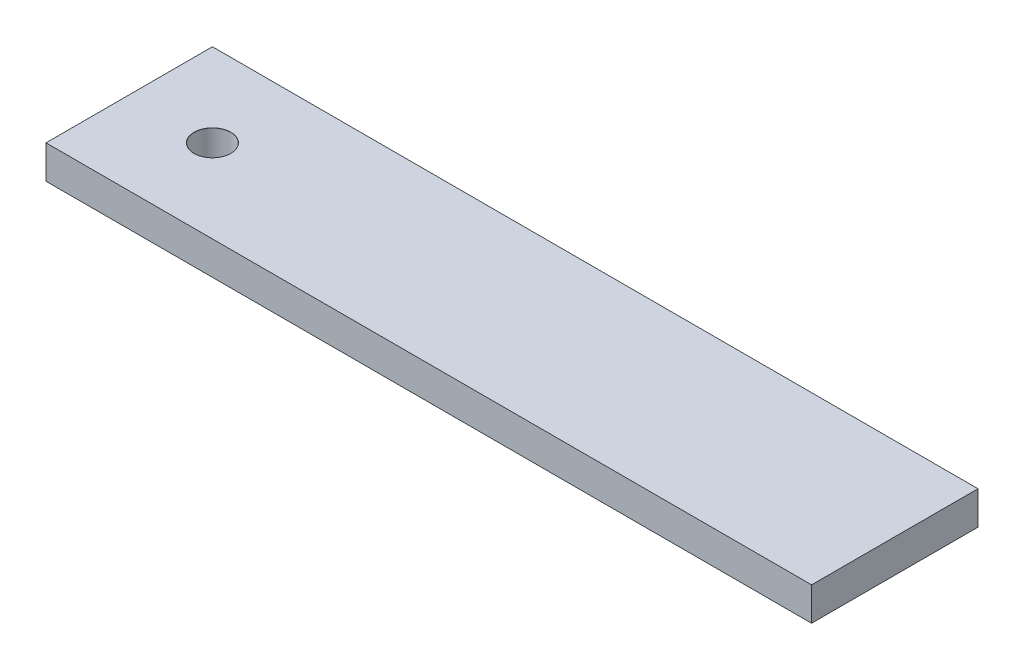
ISO-10303-21;
HEADER;
FILE_DESCRIPTION(('STEP AP214'),'2;1');
FILE_NAME('part.step','',(''),(''),'','','');
FILE_SCHEMA(('AUTOMOTIVE_DESIGN { 1 0 10303 214 1 1 1 1 }'));
ENDSEC;
DATA;
#1=APPLICATION_CONTEXT('core data for automotive mechanical design processes');
#2=APPLICATION_PROTOCOL_DEFINITION('international standard','automotive_design',2000,#1);
#3=PRODUCT_CONTEXT('',#1,'mechanical');
#4=PRODUCT('Part','Part','',(#3));
#5=PRODUCT_RELATED_PRODUCT_CATEGORY('part','',(#4));
#6=PRODUCT_DEFINITION_FORMATION('','',#4);
#7=PRODUCT_DEFINITION_CONTEXT('part definition',#1,'design');
#8=PRODUCT_DEFINITION('design','',#6,#7);
#9=PRODUCT_DEFINITION_SHAPE('','',#8);
#10=(LENGTH_UNIT() NAMED_UNIT(*) SI_UNIT(.MILLI.,.METRE.));
#11=(NAMED_UNIT(*) PLANE_ANGLE_UNIT() SI_UNIT($,.RADIAN.));
#12=(NAMED_UNIT(*) SI_UNIT($,.STERADIAN.) SOLID_ANGLE_UNIT());
#13=UNCERTAINTY_MEASURE_WITH_UNIT(LENGTH_MEASURE(1.E-05),#10,'distance_accuracy_value','');
#14=(GEOMETRIC_REPRESENTATION_CONTEXT(3) GLOBAL_UNCERTAINTY_ASSIGNED_CONTEXT((#13)) GLOBAL_UNIT_ASSIGNED_CONTEXT((#10,
#11,#12)) REPRESENTATION_CONTEXT('',''));
#15=CARTESIAN_POINT('',(0.,0.,0.));
#16=DIRECTION('',(0.,0.,1.));
#17=DIRECTION('',(1.,0.,0.));
#18=AXIS2_PLACEMENT_3D('',#15,#16,#17);
#19=CARTESIAN_POINT('',(115.,10.,-25.));
#20=DIRECTION('',(-1.,0.,0.));
#21=DIRECTION('',(0.,0.,1.));
#22=AXIS2_PLACEMENT_3D('',#19,#20,#21);
#23=PLANE('',#22);
#24=DIRECTION('',(0.,0.,-1.));
#25=VECTOR('',#24,1.);
#26=CARTESIAN_POINT('',(115.,0.,-25.));
#27=LINE('',#26,#25);
#28=CARTESIAN_POINT('',(115.,0.,25.));
#29=VERTEX_POINT('',#28);
#30=CARTESIAN_POINT('',(115.,0.,-25.));
#31=VERTEX_POINT('',#30);
#32=EDGE_CURVE('E102',#29,#31,#27,.T.);
#33=ORIENTED_EDGE('',*,*,#32,.T.);
#34=DIRECTION('',(0.,-1.,0.));
#35=VECTOR('',#34,1.);
#36=CARTESIAN_POINT('',(115.,10.,-25.));
#37=LINE('',#36,#35);
#38=CARTESIAN_POINT('',(115.,10.,-25.));
#39=VERTEX_POINT('',#38);
#40=EDGE_CURVE('E11',#39,#31,#37,.T.);
#41=ORIENTED_EDGE('',*,*,#40,.F.);
#42=DIRECTION('',(0.,0.,-1.));
#43=VECTOR('',#42,1.);
#44=CARTESIAN_POINT('',(115.,10.,-25.));
#45=LINE('',#44,#43);
#46=CARTESIAN_POINT('',(115.,10.,25.));
#47=VERTEX_POINT('',#46);
#48=EDGE_CURVE('E90',#47,#39,#45,.T.);
#49=ORIENTED_EDGE('',*,*,#48,.F.);
#50=DIRECTION('',(0.,-1.,0.));
#51=VECTOR('',#50,1.);
#52=CARTESIAN_POINT('',(115.,10.,25.));
#53=LINE('',#52,#51);
#54=EDGE_CURVE('E98',#47,#29,#53,.T.);
#55=ORIENTED_EDGE('',*,*,#54,.T.);
#56=EDGE_LOOP('',(#33,#41,#49,#55));
#57=FACE_BOUND('',#56,.T.);
#58=ADVANCED_FACE('F39',(#57),#23,.F.);
#59=CARTESIAN_POINT('',(-115.,10.,-25.));
#60=DIRECTION('',(0.,0.,1.));
#61=DIRECTION('',(1.,0.,0.));
#62=AXIS2_PLACEMENT_3D('',#59,#60,#61);
#63=PLANE('',#62);
#64=DIRECTION('',(-1.,0.,0.));
#65=VECTOR('',#64,1.);
#66=CARTESIAN_POINT('',(-115.,0.,-25.));
#67=LINE('',#66,#65);
#68=CARTESIAN_POINT('',(-115.,0.,-25.));
#69=VERTEX_POINT('',#68);
#70=EDGE_CURVE('E94',#31,#69,#67,.T.);
#71=ORIENTED_EDGE('',*,*,#70,.T.);
#72=DIRECTION('',(0.,-1.,0.));
#73=VECTOR('',#72,1.);
#74=CARTESIAN_POINT('',(-115.,10.,-25.));
#75=LINE('',#74,#73);
#76=CARTESIAN_POINT('',(-115.,10.,-25.));
#77=VERTEX_POINT('',#76);
#78=EDGE_CURVE('E47',#77,#69,#75,.T.);
#79=ORIENTED_EDGE('',*,*,#78,.F.);
#80=DIRECTION('',(-1.,0.,0.));
#81=VECTOR('',#80,1.);
#82=CARTESIAN_POINT('',(-115.,10.,-25.));
#83=LINE('',#82,#81);
#84=EDGE_CURVE('E85',#39,#77,#83,.T.);
#85=ORIENTED_EDGE('',*,*,#84,.F.);
#86=ORIENTED_EDGE('',*,*,#40,.T.);
#87=EDGE_LOOP('',(#71,#79,#85,#86));
#88=FACE_BOUND('',#87,.T.);
#89=ADVANCED_FACE('F93',(#88),#63,.F.);
#90=CARTESIAN_POINT('',(-115.,10.,-25.));
#91=DIRECTION('',(1.,0.,0.));
#92=DIRECTION('',(0.,0.,-1.));
#93=AXIS2_PLACEMENT_3D('',#90,#91,#92);
#94=PLANE('',#93);
#95=DIRECTION('',(0.,0.,1.));
#96=VECTOR('',#95,1.);
#97=CARTESIAN_POINT('',(-115.,0.,-25.));
#98=LINE('',#97,#96);
#99=CARTESIAN_POINT('',(-115.,0.,25.));
#100=VERTEX_POINT('',#99);
#101=EDGE_CURVE('E72',#69,#100,#98,.T.);
#102=ORIENTED_EDGE('',*,*,#101,.T.);
#103=DIRECTION('',(0.,-1.,0.));
#104=VECTOR('',#103,1.);
#105=CARTESIAN_POINT('',(-115.,10.,25.));
#106=LINE('',#105,#104);
#107=CARTESIAN_POINT('',(-115.,10.,25.));
#108=VERTEX_POINT('',#107);
#109=EDGE_CURVE('E95',#108,#100,#106,.T.);
#110=ORIENTED_EDGE('',*,*,#109,.F.);
#111=DIRECTION('',(0.,0.,1.));
#112=VECTOR('',#111,1.);
#113=CARTESIAN_POINT('',(-115.,10.,-25.));
#114=LINE('',#113,#112);
#115=EDGE_CURVE('E88',#77,#108,#114,.T.);
#116=ORIENTED_EDGE('',*,*,#115,.F.);
#117=ORIENTED_EDGE('',*,*,#78,.T.);
#118=EDGE_LOOP('',(#102,#110,#116,#117));
#119=FACE_BOUND('',#118,.T.);
#120=ADVANCED_FACE('F96',(#119),#94,.F.);
#121=CARTESIAN_POINT('',(-115.,10.,25.));
#122=DIRECTION('',(0.,0.,-1.));
#123=DIRECTION('',(-1.,0.,0.));
#124=AXIS2_PLACEMENT_3D('',#121,#122,#123);
#125=PLANE('',#124);
#126=DIRECTION('',(1.,0.,0.));
#127=VECTOR('',#126,1.);
#128=CARTESIAN_POINT('',(-115.,0.,25.));
#129=LINE('',#128,#127);
#130=EDGE_CURVE('E78',#100,#29,#129,.T.);
#131=ORIENTED_EDGE('',*,*,#130,.T.);
#132=ORIENTED_EDGE('',*,*,#54,.F.);
#133=DIRECTION('',(1.,0.,0.));
#134=VECTOR('',#133,1.);
#135=CARTESIAN_POINT('',(-115.,10.,25.));
#136=LINE('',#135,#134);
#137=EDGE_CURVE('E55',#108,#47,#136,.T.);
#138=ORIENTED_EDGE('',*,*,#137,.F.);
#139=ORIENTED_EDGE('',*,*,#109,.T.);
#140=EDGE_LOOP('',(#131,#132,#138,#139));
#141=FACE_BOUND('',#140,.T.);
#142=ADVANCED_FACE('F110',(#141),#125,.F.);
#143=CARTESIAN_POINT('',(0.,10.,0.));
#144=DIRECTION('',(0.,1.,0.));
#145=DIRECTION('',(0.,0.,1.));
#146=AXIS2_PLACEMENT_3D('',#143,#144,#145);
#147=PLANE('',#146);
#148=CARTESIAN_POINT('',(-90.,10.,0.));
#149=DIRECTION('',(0.,1.,0.));
#150=DIRECTION('',(0.,0.,1.));
#151=AXIS2_PLACEMENT_3D('',#148,#149,#150);
#152=CIRCLE('',#151,5.525);
#153=CARTESIAN_POINT('',(-90.,10.,5.525));
#154=VERTEX_POINT('',#153);
#155=EDGE_CURVE('E121',#154,#154,#152,.T.);
#156=ORIENTED_EDGE('',*,*,#155,.F.);
#157=EDGE_LOOP('',(#156));
#158=FACE_BOUND('',#157,.T.);
#159=ORIENTED_EDGE('',*,*,#48,.T.);
#160=ORIENTED_EDGE('',*,*,#84,.T.);
#161=ORIENTED_EDGE('',*,*,#115,.T.);
#162=ORIENTED_EDGE('',*,*,#137,.T.);
#163=EDGE_LOOP('',(#159,#160,#161,#162));
#164=FACE_BOUND('',#163,.T.);
#165=ADVANCED_FACE('F86',(#158,#164),#147,.T.);
#166=CARTESIAN_POINT('',(0.,0.,0.));
#167=DIRECTION('',(0.,1.,0.));
#168=DIRECTION('',(0.,0.,1.));
#169=AXIS2_PLACEMENT_3D('',#166,#167,#168);
#170=PLANE('',#169);
#171=CARTESIAN_POINT('',(-90.,0.,0.));
#172=DIRECTION('',(0.,1.,0.));
#173=DIRECTION('',(0.,0.,1.));
#174=AXIS2_PLACEMENT_3D('',#171,#172,#173);
#175=CIRCLE('',#174,5.50000000000001);
#176=CARTESIAN_POINT('',(-90.,0.,5.50000000000001));
#177=VERTEX_POINT('',#176);
#178=EDGE_CURVE('E105',#177,#177,#175,.T.);
#179=ORIENTED_EDGE('',*,*,#178,.T.);
#180=EDGE_LOOP('',(#179));
#181=FACE_BOUND('',#180,.T.);
#182=ORIENTED_EDGE('',*,*,#32,.F.);
#183=ORIENTED_EDGE('',*,*,#130,.F.);
#184=ORIENTED_EDGE('',*,*,#101,.F.);
#185=ORIENTED_EDGE('',*,*,#70,.F.);
#186=EDGE_LOOP('',(#182,#183,#184,#185));
#187=FACE_BOUND('',#186,.T.);
#188=ADVANCED_FACE('F113',(#181,#187),#170,.F.);
#189=CARTESIAN_POINT('',(-90.,10.,0.));
#190=DIRECTION('',(0.,1.,0.));
#191=DIRECTION('',(0.,0.,1.));
#192=AXIS2_PLACEMENT_3D('',#189,#190,#191);
#193=CYLINDRICAL_SURFACE('',#192,5.50000000000001);
#194=ORIENTED_EDGE('',*,*,#178,.F.);
#195=EDGE_LOOP('',(#194));
#196=FACE_BOUND('',#195,.T.);
#197=CARTESIAN_POINT('',(-90.,9.975,0.));
#198=DIRECTION('',(0.,1.,0.));
#199=DIRECTION('',(0.,0.,1.));
#200=AXIS2_PLACEMENT_3D('',#197,#198,#199);
#201=CIRCLE('',#200,5.50000000000001);
#202=CARTESIAN_POINT('',(-90.,9.975,5.50000000000001));
#203=VERTEX_POINT('',#202);
#204=EDGE_CURVE('E118',#203,#203,#201,.T.);
#205=ORIENTED_EDGE('',*,*,#204,.T.);
#206=EDGE_LOOP('',(#205));
#207=FACE_BOUND('',#206,.T.);
#208=ADVANCED_FACE('F133',(#196,#207),#193,.F.);
#209=CARTESIAN_POINT('',(-90.,10.,0.));
#210=DIRECTION('',(0.,1.,0.));
#211=DIRECTION('',(0.,0.,1.));
#212=AXIS2_PLACEMENT_3D('',#209,#210,#211);
#213=CONICAL_SURFACE('',#212,5.525,0.785398163397344);
#214=ORIENTED_EDGE('',*,*,#204,.F.);
#215=EDGE_LOOP('',(#214));
#216=FACE_BOUND('',#215,.T.);
#217=ORIENTED_EDGE('',*,*,#155,.T.);
#218=EDGE_LOOP('',(#217));
#219=FACE_BOUND('',#218,.T.);
#220=ADVANCED_FACE('F125',(#216,#219),#213,.F.);
#221=CLOSED_SHELL('',(#58,#89,#120,#142,#165,#188,#208,#220));
#222=MANIFOLD_SOLID_BREP('B2',#221);
#223=ADVANCED_BREP_SHAPE_REPRESENTATION('',(#18,#222),#14);
#224=SHAPE_DEFINITION_REPRESENTATION(#9,#223);
ENDSEC;
END-ISO-10303-21;
